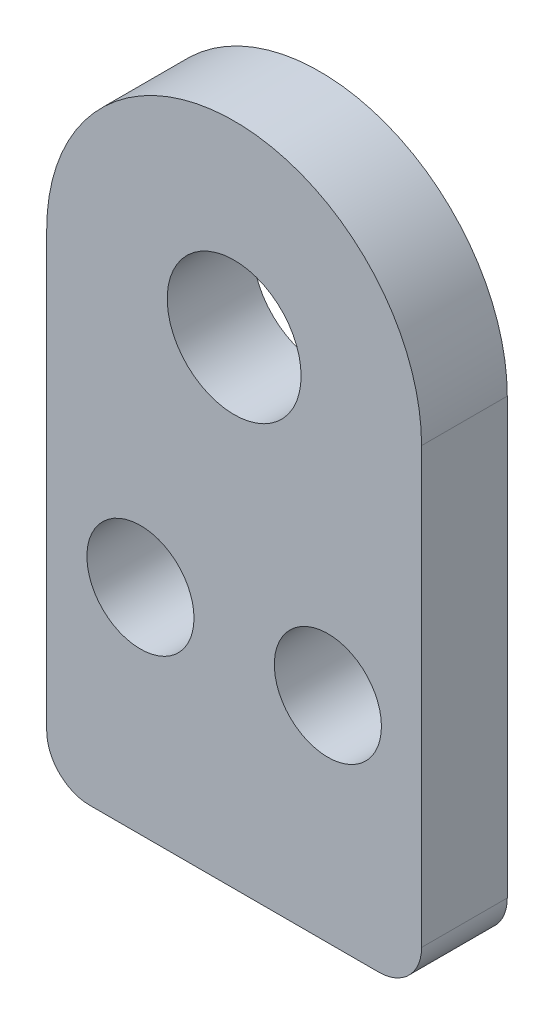
ISO-10303-21;
HEADER;
FILE_DESCRIPTION(('STEP AP214'),'2;1');
FILE_NAME('part.step','',(''),(''),'','','');
FILE_SCHEMA(('AUTOMOTIVE_DESIGN { 1 0 10303 214 1 1 1 1 }'));
ENDSEC;
DATA;
#1=APPLICATION_CONTEXT('core data for automotive mechanical design processes');
#2=APPLICATION_PROTOCOL_DEFINITION('international standard','automotive_design',2000,#1);
#3=PRODUCT_CONTEXT('',#1,'mechanical');
#4=PRODUCT('Part','Part','',(#3));
#5=PRODUCT_RELATED_PRODUCT_CATEGORY('part','',(#4));
#6=PRODUCT_DEFINITION_FORMATION('','',#4);
#7=PRODUCT_DEFINITION_CONTEXT('part definition',#1,'design');
#8=PRODUCT_DEFINITION('design','',#6,#7);
#9=PRODUCT_DEFINITION_SHAPE('','',#8);
#10=(LENGTH_UNIT() NAMED_UNIT(*) SI_UNIT(.MILLI.,.METRE.));
#11=(NAMED_UNIT(*) PLANE_ANGLE_UNIT() SI_UNIT($,.RADIAN.));
#12=(NAMED_UNIT(*) SI_UNIT($,.STERADIAN.) SOLID_ANGLE_UNIT());
#13=UNCERTAINTY_MEASURE_WITH_UNIT(LENGTH_MEASURE(1.E-05),#10,'distance_accuracy_value','');
#14=(GEOMETRIC_REPRESENTATION_CONTEXT(3) GLOBAL_UNCERTAINTY_ASSIGNED_CONTEXT((#13)) GLOBAL_UNIT_ASSIGNED_CONTEXT((#10,
#11,#12)) REPRESENTATION_CONTEXT('',''));
#15=CARTESIAN_POINT('',(0.,0.,0.));
#16=DIRECTION('',(0.,0.,1.));
#17=DIRECTION('',(1.,0.,0.));
#18=AXIS2_PLACEMENT_3D('',#15,#16,#17);
#19=CARTESIAN_POINT('',(0.,15.6083,5.08));
#20=DIRECTION('',(0.,0.,-1.));
#21=DIRECTION('',(-1.,0.,0.));
#22=AXIS2_PLACEMENT_3D('',#19,#20,#21);
#23=PLANE('',#22);
#24=DIRECTION('',(0.,-1.,0.));
#25=VECTOR('',#24,1.);
#26=CARTESIAN_POINT('',(-11.1125,15.6083,5.08));
#27=LINE('',#26,#25);
#28=CARTESIAN_POINT('',(-11.1125,15.6083,5.08));
#29=VERTEX_POINT('',#28);
#30=CARTESIAN_POINT('',(-11.1125000000001,-10.16,5.08));
#31=VERTEX_POINT('',#30);
#32=EDGE_CURVE('E110',#29,#31,#27,.T.);
#33=ORIENTED_EDGE('',*,*,#32,.T.);
#34=CARTESIAN_POINT('',(-8.57250000000001,-10.16,5.08));
#35=DIRECTION('',(0.,0.,-1.));
#36=DIRECTION('',(-1.,0.,0.));
#37=AXIS2_PLACEMENT_3D('',#34,#35,#36);
#38=CIRCLE('',#37,2.54);
#39=CARTESIAN_POINT('',(-8.57250000000001,-12.7,5.08));
#40=VERTEX_POINT('',#39);
#41=EDGE_CURVE('E46',#31,#40,#38,.F.);
#42=ORIENTED_EDGE('',*,*,#41,.T.);
#43=DIRECTION('',(1.,0.,0.));
#44=VECTOR('',#43,1.);
#45=CARTESIAN_POINT('',(-11.1125,-12.7,5.08));
#46=LINE('',#45,#44);
#47=CARTESIAN_POINT('',(8.5725,-12.7,5.08));
#48=VERTEX_POINT('',#47);
#49=EDGE_CURVE('E122',#40,#48,#46,.T.);
#50=ORIENTED_EDGE('',*,*,#49,.T.);
#51=CARTESIAN_POINT('',(8.57250000000001,-10.16,5.08));
#52=DIRECTION('',(0.,0.,-1.));
#53=DIRECTION('',(-1.,0.,0.));
#54=AXIS2_PLACEMENT_3D('',#51,#52,#53);
#55=CIRCLE('',#54,2.54);
#56=CARTESIAN_POINT('',(11.1125000000001,-10.16,5.08));
#57=VERTEX_POINT('',#56);
#58=EDGE_CURVE('E53',#48,#57,#55,.F.);
#59=ORIENTED_EDGE('',*,*,#58,.T.);
#60=DIRECTION('',(0.,1.,0.));
#61=VECTOR('',#60,1.);
#62=CARTESIAN_POINT('',(11.1125,15.6083,5.08));
#63=LINE('',#62,#61);
#64=CARTESIAN_POINT('',(11.1125,15.6083,5.08));
#65=VERTEX_POINT('',#64);
#66=EDGE_CURVE('E91',#57,#65,#63,.T.);
#67=ORIENTED_EDGE('',*,*,#66,.T.);
#68=CARTESIAN_POINT('',(0.,15.6083,5.08));
#69=DIRECTION('',(0.,0.,1.));
#70=DIRECTION('',(-1.,0.,0.));
#71=AXIS2_PLACEMENT_3D('',#68,#69,#70);
#72=CIRCLE('',#71,11.1125);
#73=EDGE_CURVE('E94',#65,#29,#72,.T.);
#74=ORIENTED_EDGE('',*,*,#73,.T.);
#75=EDGE_LOOP('',(#33,#42,#50,#59,#67,#74));
#76=FACE_BOUND('',#75,.T.);
#77=CARTESIAN_POINT('',(0.,15.6083,5.08));
#78=DIRECTION('',(0.,0.,1.));
#79=DIRECTION('',(1.,0.,0.));
#80=AXIS2_PLACEMENT_3D('',#77,#78,#79);
#81=CIRCLE('',#80,3.96875);
#82=CARTESIAN_POINT('',(3.96875,15.6083,5.08));
#83=VERTEX_POINT('',#82);
#84=EDGE_CURVE('E163',#83,#83,#81,.T.);
#85=ORIENTED_EDGE('',*,*,#84,.F.);
#86=EDGE_LOOP('',(#85));
#87=FACE_BOUND('',#86,.T.);
#88=CARTESIAN_POINT('',(-5.55625,0.,5.08));
#89=DIRECTION('',(0.,0.,1.));
#90=DIRECTION('',(1.,0.,0.));
#91=AXIS2_PLACEMENT_3D('',#88,#89,#90);
#92=CIRCLE('',#91,3.175);
#93=CARTESIAN_POINT('',(-2.38125,0.,5.08));
#94=VERTEX_POINT('',#93);
#95=EDGE_CURVE('E173',#94,#94,#92,.T.);
#96=ORIENTED_EDGE('',*,*,#95,.F.);
#97=EDGE_LOOP('',(#96));
#98=FACE_BOUND('',#97,.T.);
#99=CARTESIAN_POINT('',(5.55625,0.,5.08));
#100=DIRECTION('',(0.,0.,1.));
#101=DIRECTION('',(1.,0.,0.));
#102=AXIS2_PLACEMENT_3D('',#99,#100,#101);
#103=CIRCLE('',#102,3.175);
#104=CARTESIAN_POINT('',(8.73125,0.,5.08));
#105=VERTEX_POINT('',#104);
#106=EDGE_CURVE('E181',#105,#105,#103,.T.);
#107=ORIENTED_EDGE('',*,*,#106,.F.);
#108=EDGE_LOOP('',(#107));
#109=FACE_BOUND('',#108,.T.);
#110=ADVANCED_FACE('F37',(#76,#87,#98,#109),#23,.F.);
#111=CARTESIAN_POINT('',(0.,15.6083,0.));
#112=DIRECTION('',(0.,0.,-1.));
#113=DIRECTION('',(-1.,0.,0.));
#114=AXIS2_PLACEMENT_3D('',#111,#112,#113);
#115=PLANE('',#114);
#116=CARTESIAN_POINT('',(-5.55625,0.,0.));
#117=DIRECTION('',(0.,0.,1.));
#118=DIRECTION('',(1.,0.,0.));
#119=AXIS2_PLACEMENT_3D('',#116,#117,#118);
#120=CIRCLE('',#119,3.175);
#121=CARTESIAN_POINT('',(-2.38125,0.,0.));
#122=VERTEX_POINT('',#121);
#123=EDGE_CURVE('E177',#122,#122,#120,.T.);
#124=ORIENTED_EDGE('',*,*,#123,.T.);
#125=EDGE_LOOP('',(#124));
#126=FACE_BOUND('',#125,.T.);
#127=DIRECTION('',(1.,0.,0.));
#128=VECTOR('',#127,1.);
#129=CARTESIAN_POINT('',(-11.1125,-12.7,0.));
#130=LINE('',#129,#128);
#131=CARTESIAN_POINT('',(-8.57250000000001,-12.7,0.));
#132=VERTEX_POINT('',#131);
#133=CARTESIAN_POINT('',(8.5725,-12.7,0.));
#134=VERTEX_POINT('',#133);
#135=EDGE_CURVE('E155',#132,#134,#130,.T.);
#136=ORIENTED_EDGE('',*,*,#135,.F.);
#137=CARTESIAN_POINT('',(-8.57250000000001,-10.16,0.));
#138=DIRECTION('',(0.,0.,-1.));
#139=DIRECTION('',(-1.,0.,0.));
#140=AXIS2_PLACEMENT_3D('',#137,#138,#139);
#141=CIRCLE('',#140,2.54);
#142=CARTESIAN_POINT('',(-11.1125,-10.16,0.));
#143=VERTEX_POINT('',#142);
#144=EDGE_CURVE('E132',#132,#143,#141,.T.);
#145=ORIENTED_EDGE('',*,*,#144,.T.);
#146=DIRECTION('',(0.,-1.,0.));
#147=VECTOR('',#146,1.);
#148=CARTESIAN_POINT('',(-11.1125,-12.7,0.));
#149=LINE('',#148,#147);
#150=CARTESIAN_POINT('',(-11.1125,15.6083,0.));
#151=VERTEX_POINT('',#150);
#152=EDGE_CURVE('E154',#151,#143,#149,.T.);
#153=ORIENTED_EDGE('',*,*,#152,.F.);
#154=CARTESIAN_POINT('',(0.,15.6083,0.));
#155=DIRECTION('',(0.,0.,1.));
#156=DIRECTION('',(-1.,0.,0.));
#157=AXIS2_PLACEMENT_3D('',#154,#155,#156);
#158=CIRCLE('',#157,11.1125);
#159=CARTESIAN_POINT('',(11.1125,15.6083,0.));
#160=VERTEX_POINT('',#159);
#161=EDGE_CURVE('E158',#160,#151,#158,.T.);
#162=ORIENTED_EDGE('',*,*,#161,.F.);
#163=DIRECTION('',(0.,1.,0.));
#164=VECTOR('',#163,1.);
#165=CARTESIAN_POINT('',(11.1125,-12.7,0.));
#166=LINE('',#165,#164);
#167=CARTESIAN_POINT('',(11.1125,-10.16,0.));
#168=VERTEX_POINT('',#167);
#169=EDGE_CURVE('E100',#168,#160,#166,.T.);
#170=ORIENTED_EDGE('',*,*,#169,.F.);
#171=CARTESIAN_POINT('',(8.57250000000001,-10.16,0.));
#172=DIRECTION('',(0.,0.,-1.));
#173=DIRECTION('',(-1.,0.,0.));
#174=AXIS2_PLACEMENT_3D('',#171,#172,#173);
#175=CIRCLE('',#174,2.54);
#176=EDGE_CURVE('E129',#168,#134,#175,.T.);
#177=ORIENTED_EDGE('',*,*,#176,.T.);
#178=EDGE_LOOP('',(#136,#145,#153,#162,#170,#177));
#179=FACE_BOUND('',#178,.T.);
#180=CARTESIAN_POINT('',(0.,15.6083,0.));
#181=DIRECTION('',(0.,0.,1.));
#182=DIRECTION('',(1.,0.,0.));
#183=AXIS2_PLACEMENT_3D('',#180,#181,#182);
#184=CIRCLE('',#183,3.96875);
#185=CARTESIAN_POINT('',(3.96875,15.6083,0.));
#186=VERTEX_POINT('',#185);
#187=EDGE_CURVE('E169',#186,#186,#184,.T.);
#188=ORIENTED_EDGE('',*,*,#187,.T.);
#189=EDGE_LOOP('',(#188));
#190=FACE_BOUND('',#189,.T.);
#191=CARTESIAN_POINT('',(5.55625,0.,0.));
#192=DIRECTION('',(0.,0.,1.));
#193=DIRECTION('',(1.,0.,0.));
#194=AXIS2_PLACEMENT_3D('',#191,#192,#193);
#195=CIRCLE('',#194,3.175);
#196=CARTESIAN_POINT('',(8.73125,0.,0.));
#197=VERTEX_POINT('',#196);
#198=EDGE_CURVE('E185',#197,#197,#195,.T.);
#199=ORIENTED_EDGE('',*,*,#198,.T.);
#200=EDGE_LOOP('',(#199));
#201=FACE_BOUND('',#200,.T.);
#202=ADVANCED_FACE('F152',(#126,#179,#190,#201),#115,.T.);
#203=CARTESIAN_POINT('',(0.,15.6083,5.08));
#204=DIRECTION('',(0.,0.,-1.));
#205=DIRECTION('',(-1.,0.,0.));
#206=AXIS2_PLACEMENT_3D('',#203,#204,#205);
#207=CYLINDRICAL_SURFACE('',#206,11.1125);
#208=ORIENTED_EDGE('',*,*,#161,.T.);
#209=DIRECTION('',(0.,0.,-1.));
#210=VECTOR('',#209,1.);
#211=CARTESIAN_POINT('',(-11.1125,15.6083,5.08));
#212=LINE('',#211,#210);
#213=EDGE_CURVE('E108',#29,#151,#212,.T.);
#214=ORIENTED_EDGE('',*,*,#213,.F.);
#215=ORIENTED_EDGE('',*,*,#73,.F.);
#216=DIRECTION('',(0.,0.,-1.));
#217=VECTOR('',#216,1.);
#218=CARTESIAN_POINT('',(11.1125,15.6083,5.08));
#219=LINE('',#218,#217);
#220=EDGE_CURVE('E106',#65,#160,#219,.T.);
#221=ORIENTED_EDGE('',*,*,#220,.T.);
#222=EDGE_LOOP('',(#208,#214,#215,#221));
#223=FACE_BOUND('',#222,.T.);
#224=ADVANCED_FACE('F105',(#223),#207,.T.);
#225=CARTESIAN_POINT('',(-11.1125,-12.7,5.08));
#226=DIRECTION('',(1.,0.,0.));
#227=DIRECTION('',(0.,0.,-1.));
#228=AXIS2_PLACEMENT_3D('',#225,#226,#227);
#229=PLANE('',#228);
#230=ORIENTED_EDGE('',*,*,#152,.T.);
#231=DIRECTION('',(0.,0.,-1.));
#232=VECTOR('',#231,1.);
#233=CARTESIAN_POINT('',(-11.1125,-10.16,5.08));
#234=LINE('',#233,#232);
#235=EDGE_CURVE('E61',#143,#31,#234,.F.);
#236=ORIENTED_EDGE('',*,*,#235,.T.);
#237=ORIENTED_EDGE('',*,*,#32,.F.);
#238=ORIENTED_EDGE('',*,*,#213,.T.);
#239=EDGE_LOOP('',(#230,#236,#237,#238));
#240=FACE_BOUND('',#239,.T.);
#241=ADVANCED_FACE('F156',(#240),#229,.F.);
#242=CARTESIAN_POINT('',(-11.1125,-12.7,5.08));
#243=DIRECTION('',(0.,1.,0.));
#244=DIRECTION('',(0.,0.,1.));
#245=AXIS2_PLACEMENT_3D('',#242,#243,#244);
#246=PLANE('',#245);
#247=ORIENTED_EDGE('',*,*,#49,.F.);
#248=DIRECTION('',(0.,0.,-1.));
#249=VECTOR('',#248,1.);
#250=CARTESIAN_POINT('',(-8.57250000000001,-12.7,5.08));
#251=LINE('',#250,#249);
#252=EDGE_CURVE('E120',#40,#132,#251,.T.);
#253=ORIENTED_EDGE('',*,*,#252,.T.);
#254=ORIENTED_EDGE('',*,*,#135,.T.);
#255=DIRECTION('',(0.,0.,-1.));
#256=VECTOR('',#255,1.);
#257=CARTESIAN_POINT('',(8.57250000000001,-12.7,5.08));
#258=LINE('',#257,#256);
#259=EDGE_CURVE('E116',#134,#48,#258,.F.);
#260=ORIENTED_EDGE('',*,*,#259,.T.);
#261=EDGE_LOOP('',(#247,#253,#254,#260));
#262=FACE_BOUND('',#261,.T.);
#263=ADVANCED_FACE('F144',(#262),#246,.F.);
#264=CARTESIAN_POINT('',(11.1125,-12.7,5.08));
#265=DIRECTION('',(-1.,0.,0.));
#266=DIRECTION('',(0.,0.,1.));
#267=AXIS2_PLACEMENT_3D('',#264,#265,#266);
#268=PLANE('',#267);
#269=ORIENTED_EDGE('',*,*,#66,.F.);
#270=DIRECTION('',(0.,0.,-1.));
#271=VECTOR('',#270,1.);
#272=CARTESIAN_POINT('',(11.1125,-10.16,5.08));
#273=LINE('',#272,#271);
#274=EDGE_CURVE('E11',#57,#168,#273,.T.);
#275=ORIENTED_EDGE('',*,*,#274,.T.);
#276=ORIENTED_EDGE('',*,*,#169,.T.);
#277=ORIENTED_EDGE('',*,*,#220,.F.);
#278=EDGE_LOOP('',(#269,#275,#276,#277));
#279=FACE_BOUND('',#278,.T.);
#280=ADVANCED_FACE('F112',(#279),#268,.F.);
#281=CARTESIAN_POINT('',(0.,15.6083,5.08));
#282=DIRECTION('',(0.,0.,-1.));
#283=DIRECTION('',(-1.,0.,0.));
#284=AXIS2_PLACEMENT_3D('',#281,#282,#283);
#285=CYLINDRICAL_SURFACE('',#284,3.96875);
#286=ORIENTED_EDGE('',*,*,#84,.T.);
#287=EDGE_LOOP('',(#286));
#288=FACE_BOUND('',#287,.T.);
#289=ORIENTED_EDGE('',*,*,#187,.F.);
#290=EDGE_LOOP('',(#289));
#291=FACE_BOUND('',#290,.T.);
#292=ADVANCED_FACE('F204',(#288,#291),#285,.F.);
#293=CARTESIAN_POINT('',(-5.55625,0.,5.08));
#294=DIRECTION('',(0.,0.,-1.));
#295=DIRECTION('',(-1.,0.,0.));
#296=AXIS2_PLACEMENT_3D('',#293,#294,#295);
#297=CYLINDRICAL_SURFACE('',#296,3.175);
#298=ORIENTED_EDGE('',*,*,#95,.T.);
#299=EDGE_LOOP('',(#298));
#300=FACE_BOUND('',#299,.T.);
#301=ORIENTED_EDGE('',*,*,#123,.F.);
#302=EDGE_LOOP('',(#301));
#303=FACE_BOUND('',#302,.T.);
#304=ADVANCED_FACE('F220',(#300,#303),#297,.F.);
#305=CARTESIAN_POINT('',(5.55625,0.,5.08));
#306=DIRECTION('',(0.,0.,-1.));
#307=DIRECTION('',(-1.,0.,0.));
#308=AXIS2_PLACEMENT_3D('',#305,#306,#307);
#309=CYLINDRICAL_SURFACE('',#308,3.175);
#310=ORIENTED_EDGE('',*,*,#106,.T.);
#311=EDGE_LOOP('',(#310));
#312=FACE_BOUND('',#311,.T.);
#313=ORIENTED_EDGE('',*,*,#198,.F.);
#314=EDGE_LOOP('',(#313));
#315=FACE_BOUND('',#314,.T.);
#316=ADVANCED_FACE('F193',(#312,#315),#309,.F.);
#317=CARTESIAN_POINT('',(-8.57250000000001,-10.16,5.08));
#318=DIRECTION('',(0.,0.,-1.));
#319=DIRECTION('',(-1.,0.,0.));
#320=AXIS2_PLACEMENT_3D('',#317,#318,#319);
#321=CYLINDRICAL_SURFACE('',#320,2.54);
#322=ORIENTED_EDGE('',*,*,#41,.F.);
#323=ORIENTED_EDGE('',*,*,#235,.F.);
#324=ORIENTED_EDGE('',*,*,#144,.F.);
#325=ORIENTED_EDGE('',*,*,#252,.F.);
#326=EDGE_LOOP('',(#322,#323,#324,#325));
#327=FACE_BOUND('',#326,.T.);
#328=ADVANCED_FACE('F150',(#327),#321,.T.);
#329=CARTESIAN_POINT('',(8.57250000000001,-10.16,5.08));
#330=DIRECTION('',(0.,0.,-1.));
#331=DIRECTION('',(-1.,0.,0.));
#332=AXIS2_PLACEMENT_3D('',#329,#330,#331);
#333=CYLINDRICAL_SURFACE('',#332,2.54);
#334=ORIENTED_EDGE('',*,*,#58,.F.);
#335=ORIENTED_EDGE('',*,*,#259,.F.);
#336=ORIENTED_EDGE('',*,*,#176,.F.);
#337=ORIENTED_EDGE('',*,*,#274,.F.);
#338=EDGE_LOOP('',(#334,#335,#336,#337));
#339=FACE_BOUND('',#338,.T.);
#340=ADVANCED_FACE('F39',(#339),#333,.T.);
#341=CLOSED_SHELL('',(#110,#202,#224,#241,#263,#280,#292,#304,#316,#328,#340));
#342=MANIFOLD_SOLID_BREP('B2',#341);
#343=ADVANCED_BREP_SHAPE_REPRESENTATION('',(#18,#342),#14);
#344=SHAPE_DEFINITION_REPRESENTATION(#9,#343);
ENDSEC;
END-ISO-10303-21;
